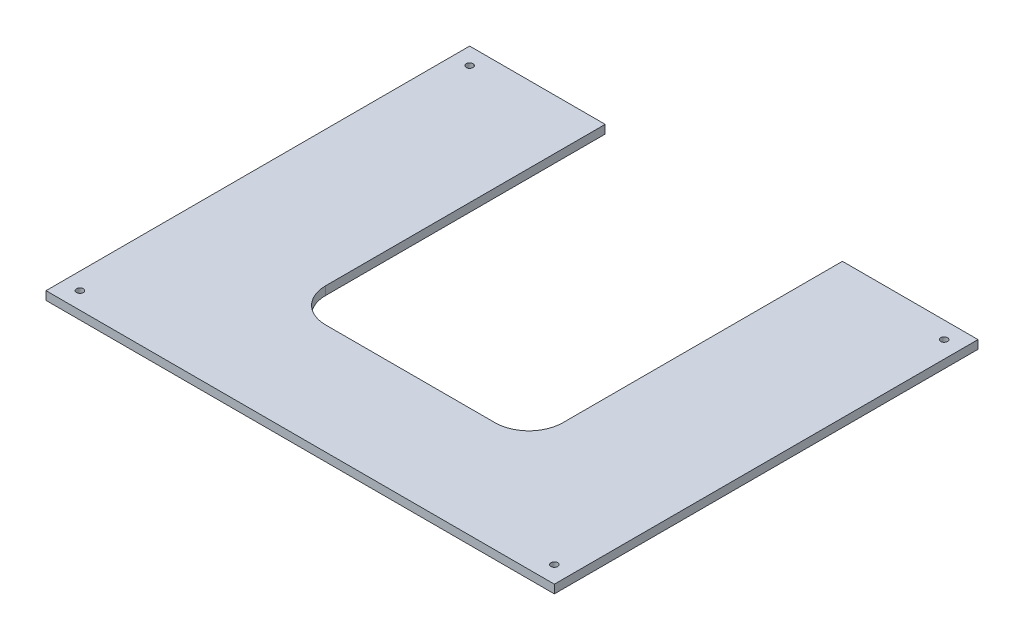
ISO-10303-21;
HEADER;
FILE_DESCRIPTION(('STEP AP214'),'2;1');
FILE_NAME('part.step','',(''),(''),'','','');
FILE_SCHEMA(('AUTOMOTIVE_DESIGN { 1 0 10303 214 1 1 1 1 }'));
ENDSEC;
DATA;
#1=APPLICATION_CONTEXT('core data for automotive mechanical design processes');
#2=APPLICATION_PROTOCOL_DEFINITION('international standard','automotive_design',2000,#1);
#3=PRODUCT_CONTEXT('',#1,'mechanical');
#4=PRODUCT('Part','Part','',(#3));
#5=PRODUCT_RELATED_PRODUCT_CATEGORY('part','',(#4));
#6=PRODUCT_DEFINITION_FORMATION('','',#4);
#7=PRODUCT_DEFINITION_CONTEXT('part definition',#1,'design');
#8=PRODUCT_DEFINITION('design','',#6,#7);
#9=PRODUCT_DEFINITION_SHAPE('','',#8);
#10=(LENGTH_UNIT() NAMED_UNIT(*) SI_UNIT(.MILLI.,.METRE.));
#11=(NAMED_UNIT(*) PLANE_ANGLE_UNIT() SI_UNIT($,.RADIAN.));
#12=(NAMED_UNIT(*) SI_UNIT($,.STERADIAN.) SOLID_ANGLE_UNIT());
#13=UNCERTAINTY_MEASURE_WITH_UNIT(LENGTH_MEASURE(1.E-05),#10,'distance_accuracy_value','');
#14=(GEOMETRIC_REPRESENTATION_CONTEXT(3) GLOBAL_UNCERTAINTY_ASSIGNED_CONTEXT((#13)) GLOBAL_UNIT_ASSIGNED_CONTEXT((#10,
#11,#12)) REPRESENTATION_CONTEXT('',''));
#15=CARTESIAN_POINT('',(0.,0.,0.));
#16=DIRECTION('',(0.,0.,1.));
#17=DIRECTION('',(1.,0.,0.));
#18=AXIS2_PLACEMENT_3D('',#15,#16,#17);
#19=CARTESIAN_POINT('',(-150.,5.,-125.));
#20=DIRECTION('',(0.,0.,1.));
#21=DIRECTION('',(1.,0.,0.));
#22=AXIS2_PLACEMENT_3D('',#19,#20,#21);
#23=PLANE('',#22);
#24=DIRECTION('',(-1.,0.,0.));
#25=VECTOR('',#24,1.);
#26=CARTESIAN_POINT('',(-150.,5.,-125.));
#27=LINE('',#26,#25);
#28=CARTESIAN_POINT('',(-70.,5.,-125.));
#29=VERTEX_POINT('',#28);
#30=CARTESIAN_POINT('',(-150.,5.,-125.));
#31=VERTEX_POINT('',#30);
#32=EDGE_CURVE('E232',#29,#31,#27,.T.);
#33=ORIENTED_EDGE('',*,*,#32,.F.);
#34=DIRECTION('',(0.,1.,0.));
#35=VECTOR('',#34,1.);
#36=CARTESIAN_POINT('',(-70.,0.,-125.));
#37=LINE('',#36,#35);
#38=CARTESIAN_POINT('',(-70.,0.,-125.));
#39=VERTEX_POINT('',#38);
#40=EDGE_CURVE('E132',#39,#29,#37,.T.);
#41=ORIENTED_EDGE('',*,*,#40,.F.);
#42=DIRECTION('',(-1.,0.,0.));
#43=VECTOR('',#42,1.);
#44=CARTESIAN_POINT('',(-150.,0.,-125.));
#45=LINE('',#44,#43);
#46=CARTESIAN_POINT('',(-150.,0.,-125.));
#47=VERTEX_POINT('',#46);
#48=EDGE_CURVE('E139',#39,#47,#45,.T.);
#49=ORIENTED_EDGE('',*,*,#48,.T.);
#50=DIRECTION('',(0.,-1.,0.));
#51=VECTOR('',#50,1.);
#52=CARTESIAN_POINT('',(-150.,5.,-125.));
#53=LINE('',#52,#51);
#54=EDGE_CURVE('E156',#31,#47,#53,.T.);
#55=ORIENTED_EDGE('',*,*,#54,.F.);
#56=EDGE_LOOP('',(#33,#41,#49,#55));
#57=FACE_BOUND('',#56,.T.);
#58=ADVANCED_FACE('F34',(#57),#23,.F.);
#59=CARTESIAN_POINT('',(0.,5.,0.));
#60=DIRECTION('',(0.,-1.,0.));
#61=DIRECTION('',(0.,0.,-1.));
#62=AXIS2_PLACEMENT_3D('',#59,#60,#61);
#63=PLANE('',#62);
#64=DIRECTION('',(1.,0.,0.));
#65=VECTOR('',#64,1.);
#66=CARTESIAN_POINT('',(-70.,5.,60.));
#67=LINE('',#66,#65);
#68=CARTESIAN_POINT('',(-50.,5.,60.));
#69=VERTEX_POINT('',#68);
#70=CARTESIAN_POINT('',(50.,5.,60.));
#71=VERTEX_POINT('',#70);
#72=EDGE_CURVE('E173',#69,#71,#67,.T.);
#73=ORIENTED_EDGE('',*,*,#72,.F.);
#74=CARTESIAN_POINT('',(-50.,5.,40.));
#75=DIRECTION('',(0.,-1.,0.));
#76=DIRECTION('',(0.,0.,-1.));
#77=AXIS2_PLACEMENT_3D('',#74,#75,#76);
#78=CIRCLE('',#77,20.);
#79=CARTESIAN_POINT('',(-70.,5.,40.));
#80=VERTEX_POINT('',#79);
#81=EDGE_CURVE('E42',#69,#80,#78,.T.);
#82=ORIENTED_EDGE('',*,*,#81,.T.);
#83=DIRECTION('',(0.,0.,1.));
#84=VECTOR('',#83,1.);
#85=CARTESIAN_POINT('',(-70.,5.,-125.));
#86=LINE('',#85,#84);
#87=EDGE_CURVE('E180',#29,#80,#86,.T.);
#88=ORIENTED_EDGE('',*,*,#87,.F.);
#89=ORIENTED_EDGE('',*,*,#32,.T.);
#90=DIRECTION('',(0.,0.,1.));
#91=VECTOR('',#90,1.);
#92=CARTESIAN_POINT('',(-150.,5.,125.));
#93=LINE('',#92,#91);
#94=CARTESIAN_POINT('',(-150.,5.,125.));
#95=VERTEX_POINT('',#94);
#96=EDGE_CURVE('E235',#31,#95,#93,.T.);
#97=ORIENTED_EDGE('',*,*,#96,.T.);
#98=DIRECTION('',(1.,0.,0.));
#99=VECTOR('',#98,1.);
#100=CARTESIAN_POINT('',(-150.,5.,125.));
#101=LINE('',#100,#99);
#102=CARTESIAN_POINT('',(150.,5.,125.));
#103=VERTEX_POINT('',#102);
#104=EDGE_CURVE('E153',#95,#103,#101,.T.);
#105=ORIENTED_EDGE('',*,*,#104,.T.);
#106=DIRECTION('',(0.,0.,-1.));
#107=VECTOR('',#106,1.);
#108=CARTESIAN_POINT('',(150.,5.,125.));
#109=LINE('',#108,#107);
#110=CARTESIAN_POINT('',(150.,5.,-125.));
#111=VERTEX_POINT('',#110);
#112=EDGE_CURVE('E148',#103,#111,#109,.T.);
#113=ORIENTED_EDGE('',*,*,#112,.T.);
#114=CARTESIAN_POINT('',(70.,5.,-125.));
#115=VERTEX_POINT('',#114);
#116=EDGE_CURVE('E233',#111,#115,#27,.T.);
#117=ORIENTED_EDGE('',*,*,#116,.T.);
#118=DIRECTION('',(0.,0.,-1.));
#119=VECTOR('',#118,1.);
#120=CARTESIAN_POINT('',(70.,5.,-125.));
#121=LINE('',#120,#119);
#122=CARTESIAN_POINT('',(70.,5.,40.));
#123=VERTEX_POINT('',#122);
#124=EDGE_CURVE('E129',#123,#115,#121,.T.);
#125=ORIENTED_EDGE('',*,*,#124,.F.);
#126=CARTESIAN_POINT('',(50.,5.,40.));
#127=DIRECTION('',(0.,-1.,0.));
#128=DIRECTION('',(0.,0.,-1.));
#129=AXIS2_PLACEMENT_3D('',#126,#127,#128);
#130=CIRCLE('',#129,20.);
#131=EDGE_CURVE('E168',#123,#71,#130,.T.);
#132=ORIENTED_EDGE('',*,*,#131,.T.);
#133=EDGE_LOOP('',(#73,#82,#88,#89,#97,#105,#113,#117,#125,#132));
#134=FACE_BOUND('',#133,.T.);
#135=CARTESIAN_POINT('',(-140.,5.,115.));
#136=DIRECTION('',(0.,1.,0.));
#137=DIRECTION('',(0.,0.,1.));
#138=AXIS2_PLACEMENT_3D('',#135,#136,#137);
#139=CIRCLE('',#138,2.);
#140=CARTESIAN_POINT('',(-140.,5.,117.));
#141=VERTEX_POINT('',#140);
#142=EDGE_CURVE('E217',#141,#141,#139,.T.);
#143=ORIENTED_EDGE('',*,*,#142,.F.);
#144=EDGE_LOOP('',(#143));
#145=FACE_BOUND('',#144,.T.);
#146=CARTESIAN_POINT('',(-140.,5.,-115.));
#147=DIRECTION('',(0.,1.,0.));
#148=DIRECTION('',(0.,0.,-1.));
#149=AXIS2_PLACEMENT_3D('',#146,#147,#148);
#150=CIRCLE('',#149,2.);
#151=CARTESIAN_POINT('',(-140.,5.,-117.));
#152=VERTEX_POINT('',#151);
#153=EDGE_CURVE('E224',#152,#152,#150,.T.);
#154=ORIENTED_EDGE('',*,*,#153,.F.);
#155=EDGE_LOOP('',(#154));
#156=FACE_BOUND('',#155,.T.);
#157=CARTESIAN_POINT('',(140.,5.,115.));
#158=DIRECTION('',(0.,1.,0.));
#159=DIRECTION('',(0.,0.,-1.));
#160=AXIS2_PLACEMENT_3D('',#157,#158,#159);
#161=CIRCLE('',#160,2.);
#162=CARTESIAN_POINT('',(140.,5.,113.));
#163=VERTEX_POINT('',#162);
#164=EDGE_CURVE('E254',#163,#163,#161,.T.);
#165=ORIENTED_EDGE('',*,*,#164,.F.);
#166=EDGE_LOOP('',(#165));
#167=FACE_BOUND('',#166,.T.);
#168=CARTESIAN_POINT('',(140.,5.,-115.));
#169=DIRECTION('',(0.,1.,0.));
#170=DIRECTION('',(0.,0.,1.));
#171=AXIS2_PLACEMENT_3D('',#168,#169,#170);
#172=CIRCLE('',#171,2.);
#173=CARTESIAN_POINT('',(140.,5.,-113.));
#174=VERTEX_POINT('',#173);
#175=EDGE_CURVE('E247',#174,#174,#172,.T.);
#176=ORIENTED_EDGE('',*,*,#175,.F.);
#177=EDGE_LOOP('',(#176));
#178=FACE_BOUND('',#177,.T.);
#179=ADVANCED_FACE('F171',(#134,#145,#156,#167,#178),#63,.F.);
#180=CARTESIAN_POINT('',(0.,0.,0.));
#181=DIRECTION('',(0.,-1.,0.));
#182=DIRECTION('',(0.,0.,-1.));
#183=AXIS2_PLACEMENT_3D('',#180,#181,#182);
#184=PLANE('',#183);
#185=DIRECTION('',(0.,0.,1.));
#186=VECTOR('',#185,1.);
#187=CARTESIAN_POINT('',(-70.,0.,-125.));
#188=LINE('',#187,#186);
#189=CARTESIAN_POINT('',(-70.,0.,40.));
#190=VERTEX_POINT('',#189);
#191=EDGE_CURVE('E369',#39,#190,#188,.T.);
#192=ORIENTED_EDGE('',*,*,#191,.T.);
#193=CARTESIAN_POINT('',(-50.,0.,40.));
#194=DIRECTION('',(0.,-1.,0.));
#195=DIRECTION('',(0.,0.,-1.));
#196=AXIS2_PLACEMENT_3D('',#193,#194,#195);
#197=CIRCLE('',#196,20.);
#198=CARTESIAN_POINT('',(-50.,0.,60.));
#199=VERTEX_POINT('',#198);
#200=EDGE_CURVE('E11',#190,#199,#197,.F.);
#201=ORIENTED_EDGE('',*,*,#200,.T.);
#202=DIRECTION('',(1.,0.,0.));
#203=VECTOR('',#202,1.);
#204=CARTESIAN_POINT('',(-70.,0.,60.));
#205=LINE('',#204,#203);
#206=CARTESIAN_POINT('',(50.,0.,60.));
#207=VERTEX_POINT('',#206);
#208=EDGE_CURVE('E124',#199,#207,#205,.T.);
#209=ORIENTED_EDGE('',*,*,#208,.T.);
#210=CARTESIAN_POINT('',(50.,0.,40.));
#211=DIRECTION('',(0.,-1.,0.));
#212=DIRECTION('',(0.,0.,-1.));
#213=AXIS2_PLACEMENT_3D('',#210,#211,#212);
#214=CIRCLE('',#213,20.);
#215=CARTESIAN_POINT('',(70.,0.,40.));
#216=VERTEX_POINT('',#215);
#217=EDGE_CURVE('E119',#207,#216,#214,.F.);
#218=ORIENTED_EDGE('',*,*,#217,.T.);
#219=DIRECTION('',(0.,0.,-1.));
#220=VECTOR('',#219,1.);
#221=CARTESIAN_POINT('',(70.,0.,-125.));
#222=LINE('',#221,#220);
#223=CARTESIAN_POINT('',(70.,0.,-125.));
#224=VERTEX_POINT('',#223);
#225=EDGE_CURVE('E109',#216,#224,#222,.T.);
#226=ORIENTED_EDGE('',*,*,#225,.T.);
#227=CARTESIAN_POINT('',(150.,0.,-125.));
#228=VERTEX_POINT('',#227);
#229=EDGE_CURVE('E115',#228,#224,#45,.T.);
#230=ORIENTED_EDGE('',*,*,#229,.F.);
#231=DIRECTION('',(0.,0.,-1.));
#232=VECTOR('',#231,1.);
#233=CARTESIAN_POINT('',(150.,0.,125.));
#234=LINE('',#233,#232);
#235=CARTESIAN_POINT('',(150.,0.,125.));
#236=VERTEX_POINT('',#235);
#237=EDGE_CURVE('E143',#236,#228,#234,.T.);
#238=ORIENTED_EDGE('',*,*,#237,.F.);
#239=DIRECTION('',(1.,0.,0.));
#240=VECTOR('',#239,1.);
#241=CARTESIAN_POINT('',(-150.,0.,125.));
#242=LINE('',#241,#240);
#243=CARTESIAN_POINT('',(-150.,0.,125.));
#244=VERTEX_POINT('',#243);
#245=EDGE_CURVE('E141',#244,#236,#242,.T.);
#246=ORIENTED_EDGE('',*,*,#245,.F.);
#247=DIRECTION('',(0.,0.,1.));
#248=VECTOR('',#247,1.);
#249=CARTESIAN_POINT('',(-150.,0.,125.));
#250=LINE('',#249,#248);
#251=EDGE_CURVE('E138',#47,#244,#250,.T.);
#252=ORIENTED_EDGE('',*,*,#251,.F.);
#253=ORIENTED_EDGE('',*,*,#48,.F.);
#254=EDGE_LOOP('',(#192,#201,#209,#218,#226,#230,#238,#246,#252,#253));
#255=FACE_BOUND('',#254,.T.);
#256=CARTESIAN_POINT('',(140.,0.,115.));
#257=DIRECTION('',(0.,1.,0.));
#258=DIRECTION('',(0.,0.,-1.));
#259=AXIS2_PLACEMENT_3D('',#256,#257,#258);
#260=CIRCLE('',#259,2.);
#261=CARTESIAN_POINT('',(140.,0.,113.));
#262=VERTEX_POINT('',#261);
#263=EDGE_CURVE('E252',#262,#262,#260,.T.);
#264=ORIENTED_EDGE('',*,*,#263,.T.);
#265=EDGE_LOOP('',(#264));
#266=FACE_BOUND('',#265,.T.);
#267=CARTESIAN_POINT('',(-140.,0.,115.));
#268=DIRECTION('',(0.,1.,0.));
#269=DIRECTION('',(0.,0.,1.));
#270=AXIS2_PLACEMENT_3D('',#267,#268,#269);
#271=CIRCLE('',#270,2.);
#272=CARTESIAN_POINT('',(-140.,0.,117.));
#273=VERTEX_POINT('',#272);
#274=EDGE_CURVE('E219',#273,#273,#271,.T.);
#275=ORIENTED_EDGE('',*,*,#274,.T.);
#276=EDGE_LOOP('',(#275));
#277=FACE_BOUND('',#276,.T.);
#278=CARTESIAN_POINT('',(-140.,0.,-115.));
#279=DIRECTION('',(0.,1.,0.));
#280=DIRECTION('',(0.,0.,-1.));
#281=AXIS2_PLACEMENT_3D('',#278,#279,#280);
#282=CIRCLE('',#281,2.);
#283=CARTESIAN_POINT('',(-140.,0.,-117.));
#284=VERTEX_POINT('',#283);
#285=EDGE_CURVE('E227',#284,#284,#282,.T.);
#286=ORIENTED_EDGE('',*,*,#285,.T.);
#287=EDGE_LOOP('',(#286));
#288=FACE_BOUND('',#287,.T.);
#289=CARTESIAN_POINT('',(140.,0.,-115.));
#290=DIRECTION('',(0.,1.,0.));
#291=DIRECTION('',(0.,0.,1.));
#292=AXIS2_PLACEMENT_3D('',#289,#290,#291);
#293=CIRCLE('',#292,2.);
#294=CARTESIAN_POINT('',(140.,0.,-113.));
#295=VERTEX_POINT('',#294);
#296=EDGE_CURVE('E244',#295,#295,#293,.T.);
#297=ORIENTED_EDGE('',*,*,#296,.T.);
#298=EDGE_LOOP('',(#297));
#299=FACE_BOUND('',#298,.T.);
#300=ADVANCED_FACE('F111',(#255,#266,#277,#288,#299),#184,.T.);
#301=CARTESIAN_POINT('',(150.,5.,125.));
#302=DIRECTION('',(-1.,0.,0.));
#303=DIRECTION('',(0.,0.,1.));
#304=AXIS2_PLACEMENT_3D('',#301,#302,#303);
#305=PLANE('',#304);
#306=ORIENTED_EDGE('',*,*,#237,.T.);
#307=DIRECTION('',(0.,-1.,0.));
#308=VECTOR('',#307,1.);
#309=CARTESIAN_POINT('',(150.,5.,-125.));
#310=LINE('',#309,#308);
#311=EDGE_CURVE('E136',#111,#228,#310,.T.);
#312=ORIENTED_EDGE('',*,*,#311,.F.);
#313=ORIENTED_EDGE('',*,*,#112,.F.);
#314=DIRECTION('',(0.,-1.,0.));
#315=VECTOR('',#314,1.);
#316=CARTESIAN_POINT('',(150.,5.,125.));
#317=LINE('',#316,#315);
#318=EDGE_CURVE('E149',#103,#236,#317,.T.);
#319=ORIENTED_EDGE('',*,*,#318,.T.);
#320=EDGE_LOOP('',(#306,#312,#313,#319));
#321=FACE_BOUND('',#320,.T.);
#322=ADVANCED_FACE('F202',(#321),#305,.F.);
#323=ORIENTED_EDGE('',*,*,#229,.T.);
#324=DIRECTION('',(0.,1.,0.));
#325=VECTOR('',#324,1.);
#326=CARTESIAN_POINT('',(70.,0.,-125.));
#327=LINE('',#326,#325);
#328=EDGE_CURVE('E123',#224,#115,#327,.T.);
#329=ORIENTED_EDGE('',*,*,#328,.T.);
#330=ORIENTED_EDGE('',*,*,#116,.F.);
#331=ORIENTED_EDGE('',*,*,#311,.T.);
#332=EDGE_LOOP('',(#323,#329,#330,#331));
#333=FACE_BOUND('',#332,.T.);
#334=ADVANCED_FACE('F134',(#333),#23,.F.);
#335=CARTESIAN_POINT('',(-150.,5.,125.));
#336=DIRECTION('',(1.,0.,0.));
#337=DIRECTION('',(0.,0.,-1.));
#338=AXIS2_PLACEMENT_3D('',#335,#336,#337);
#339=PLANE('',#338);
#340=ORIENTED_EDGE('',*,*,#251,.T.);
#341=DIRECTION('',(0.,-1.,0.));
#342=VECTOR('',#341,1.);
#343=CARTESIAN_POINT('',(-150.,5.,125.));
#344=LINE('',#343,#342);
#345=EDGE_CURVE('E152',#95,#244,#344,.T.);
#346=ORIENTED_EDGE('',*,*,#345,.F.);
#347=ORIENTED_EDGE('',*,*,#96,.F.);
#348=ORIENTED_EDGE('',*,*,#54,.T.);
#349=EDGE_LOOP('',(#340,#346,#347,#348));
#350=FACE_BOUND('',#349,.T.);
#351=ADVANCED_FACE('F201',(#350),#339,.F.);
#352=CARTESIAN_POINT('',(-150.,5.,125.));
#353=DIRECTION('',(0.,0.,-1.));
#354=DIRECTION('',(-1.,0.,0.));
#355=AXIS2_PLACEMENT_3D('',#352,#353,#354);
#356=PLANE('',#355);
#357=ORIENTED_EDGE('',*,*,#245,.T.);
#358=ORIENTED_EDGE('',*,*,#318,.F.);
#359=ORIENTED_EDGE('',*,*,#104,.F.);
#360=ORIENTED_EDGE('',*,*,#345,.T.);
#361=EDGE_LOOP('',(#357,#358,#359,#360));
#362=FACE_BOUND('',#361,.T.);
#363=ADVANCED_FACE('F207',(#362),#356,.F.);
#364=CARTESIAN_POINT('',(-140.,5.,115.));
#365=DIRECTION('',(0.,-1.,0.));
#366=DIRECTION('',(0.,0.,-1.));
#367=AXIS2_PLACEMENT_3D('',#364,#365,#366);
#368=CYLINDRICAL_SURFACE('',#367,2.);
#369=ORIENTED_EDGE('',*,*,#142,.T.);
#370=EDGE_LOOP('',(#369));
#371=FACE_BOUND('',#370,.T.);
#372=ORIENTED_EDGE('',*,*,#274,.F.);
#373=EDGE_LOOP('',(#372));
#374=FACE_BOUND('',#373,.T.);
#375=ADVANCED_FACE('F269',(#371,#374),#368,.F.);
#376=CARTESIAN_POINT('',(-140.,5.,-115.));
#377=DIRECTION('',(0.,-1.,0.));
#378=DIRECTION('',(0.,0.,-1.));
#379=AXIS2_PLACEMENT_3D('',#376,#377,#378);
#380=CYLINDRICAL_SURFACE('',#379,2.);
#381=ORIENTED_EDGE('',*,*,#153,.T.);
#382=EDGE_LOOP('',(#381));
#383=FACE_BOUND('',#382,.T.);
#384=ORIENTED_EDGE('',*,*,#285,.F.);
#385=EDGE_LOOP('',(#384));
#386=FACE_BOUND('',#385,.T.);
#387=ADVANCED_FACE('F266',(#383,#386),#380,.F.);
#388=CARTESIAN_POINT('',(140.,5.,115.));
#389=DIRECTION('',(0.,-1.,0.));
#390=DIRECTION('',(0.,0.,-1.));
#391=AXIS2_PLACEMENT_3D('',#388,#389,#390);
#392=CYLINDRICAL_SURFACE('',#391,2.);
#393=ORIENTED_EDGE('',*,*,#164,.T.);
#394=EDGE_LOOP('',(#393));
#395=FACE_BOUND('',#394,.T.);
#396=ORIENTED_EDGE('',*,*,#263,.F.);
#397=EDGE_LOOP('',(#396));
#398=FACE_BOUND('',#397,.T.);
#399=ADVANCED_FACE('F268',(#395,#398),#392,.F.);
#400=CARTESIAN_POINT('',(140.,5.,-115.));
#401=DIRECTION('',(0.,-1.,0.));
#402=DIRECTION('',(0.,0.,-1.));
#403=AXIS2_PLACEMENT_3D('',#400,#401,#402);
#404=CYLINDRICAL_SURFACE('',#403,2.);
#405=ORIENTED_EDGE('',*,*,#175,.T.);
#406=EDGE_LOOP('',(#405));
#407=FACE_BOUND('',#406,.T.);
#408=ORIENTED_EDGE('',*,*,#296,.F.);
#409=EDGE_LOOP('',(#408));
#410=FACE_BOUND('',#409,.T.);
#411=ADVANCED_FACE('F275',(#407,#410),#404,.F.);
#412=CARTESIAN_POINT('',(-70.,0.,-125.));
#413=DIRECTION('',(-1.,0.,0.));
#414=DIRECTION('',(0.,0.,1.));
#415=AXIS2_PLACEMENT_3D('',#412,#413,#414);
#416=PLANE('',#415);
#417=ORIENTED_EDGE('',*,*,#87,.T.);
#418=DIRECTION('',(0.,1.,0.));
#419=VECTOR('',#418,1.);
#420=CARTESIAN_POINT('',(-70.,0.,40.));
#421=LINE('',#420,#419);
#422=EDGE_CURVE('E49',#80,#190,#421,.F.);
#423=ORIENTED_EDGE('',*,*,#422,.T.);
#424=ORIENTED_EDGE('',*,*,#191,.F.);
#425=ORIENTED_EDGE('',*,*,#40,.T.);
#426=EDGE_LOOP('',(#417,#423,#424,#425));
#427=FACE_BOUND('',#426,.T.);
#428=ADVANCED_FACE('F308',(#427),#416,.F.);
#429=CARTESIAN_POINT('',(70.,0.,-125.));
#430=DIRECTION('',(1.,0.,0.));
#431=DIRECTION('',(0.,0.,-1.));
#432=AXIS2_PLACEMENT_3D('',#429,#430,#431);
#433=PLANE('',#432);
#434=ORIENTED_EDGE('',*,*,#225,.F.);
#435=DIRECTION('',(0.,1.,0.));
#436=VECTOR('',#435,1.);
#437=CARTESIAN_POINT('',(70.,5.,40.));
#438=LINE('',#437,#436);
#439=EDGE_CURVE('E160',#216,#123,#438,.T.);
#440=ORIENTED_EDGE('',*,*,#439,.T.);
#441=ORIENTED_EDGE('',*,*,#124,.T.);
#442=ORIENTED_EDGE('',*,*,#328,.F.);
#443=EDGE_LOOP('',(#434,#440,#441,#442));
#444=FACE_BOUND('',#443,.T.);
#445=ADVANCED_FACE('F127',(#444),#433,.F.);
#446=CARTESIAN_POINT('',(-70.,0.,60.));
#447=DIRECTION('',(0.,0.,1.));
#448=DIRECTION('',(1.,0.,0.));
#449=AXIS2_PLACEMENT_3D('',#446,#447,#448);
#450=PLANE('',#449);
#451=ORIENTED_EDGE('',*,*,#72,.T.);
#452=DIRECTION('',(0.,1.,0.));
#453=VECTOR('',#452,1.);
#454=CARTESIAN_POINT('',(50.,0.,60.));
#455=LINE('',#454,#453);
#456=EDGE_CURVE('E165',#71,#207,#455,.F.);
#457=ORIENTED_EDGE('',*,*,#456,.T.);
#458=ORIENTED_EDGE('',*,*,#208,.F.);
#459=DIRECTION('',(0.,1.,0.));
#460=VECTOR('',#459,1.);
#461=CARTESIAN_POINT('',(-50.,5.,60.));
#462=LINE('',#461,#460);
#463=EDGE_CURVE('E162',#199,#69,#462,.T.);
#464=ORIENTED_EDGE('',*,*,#463,.T.);
#465=EDGE_LOOP('',(#451,#457,#458,#464));
#466=FACE_BOUND('',#465,.T.);
#467=ADVANCED_FACE('F177',(#466),#450,.F.);
#468=CARTESIAN_POINT('',(50.,0.,40.));
#469=DIRECTION('',(0.,-1.,0.));
#470=DIRECTION('',(0.,0.,-1.));
#471=AXIS2_PLACEMENT_3D('',#468,#469,#470);
#472=CYLINDRICAL_SURFACE('',#471,20.);
#473=ORIENTED_EDGE('',*,*,#217,.F.);
#474=ORIENTED_EDGE('',*,*,#456,.F.);
#475=ORIENTED_EDGE('',*,*,#131,.F.);
#476=ORIENTED_EDGE('',*,*,#439,.F.);
#477=EDGE_LOOP('',(#473,#474,#475,#476));
#478=FACE_BOUND('',#477,.T.);
#479=ADVANCED_FACE('F182',(#478),#472,.F.);
#480=CARTESIAN_POINT('',(-50.,0.,40.));
#481=DIRECTION('',(0.,-1.,0.));
#482=DIRECTION('',(0.,0.,-1.));
#483=AXIS2_PLACEMENT_3D('',#480,#481,#482);
#484=CYLINDRICAL_SURFACE('',#483,20.);
#485=ORIENTED_EDGE('',*,*,#200,.F.);
#486=ORIENTED_EDGE('',*,*,#422,.F.);
#487=ORIENTED_EDGE('',*,*,#81,.F.);
#488=ORIENTED_EDGE('',*,*,#463,.F.);
#489=EDGE_LOOP('',(#485,#486,#487,#488));
#490=FACE_BOUND('',#489,.T.);
#491=ADVANCED_FACE('F36',(#490),#484,.F.);
#492=CLOSED_SHELL('',(#58,#179,#300,#322,#334,#351,#363,#375,#387,#399,#411,#428,#445,#467,#479,#491));
#493=MANIFOLD_SOLID_BREP('B2',#492);
#494=ADVANCED_BREP_SHAPE_REPRESENTATION('',(#18,#493),#14);
#495=SHAPE_DEFINITION_REPRESENTATION(#9,#494);
ENDSEC;
END-ISO-10303-21;
